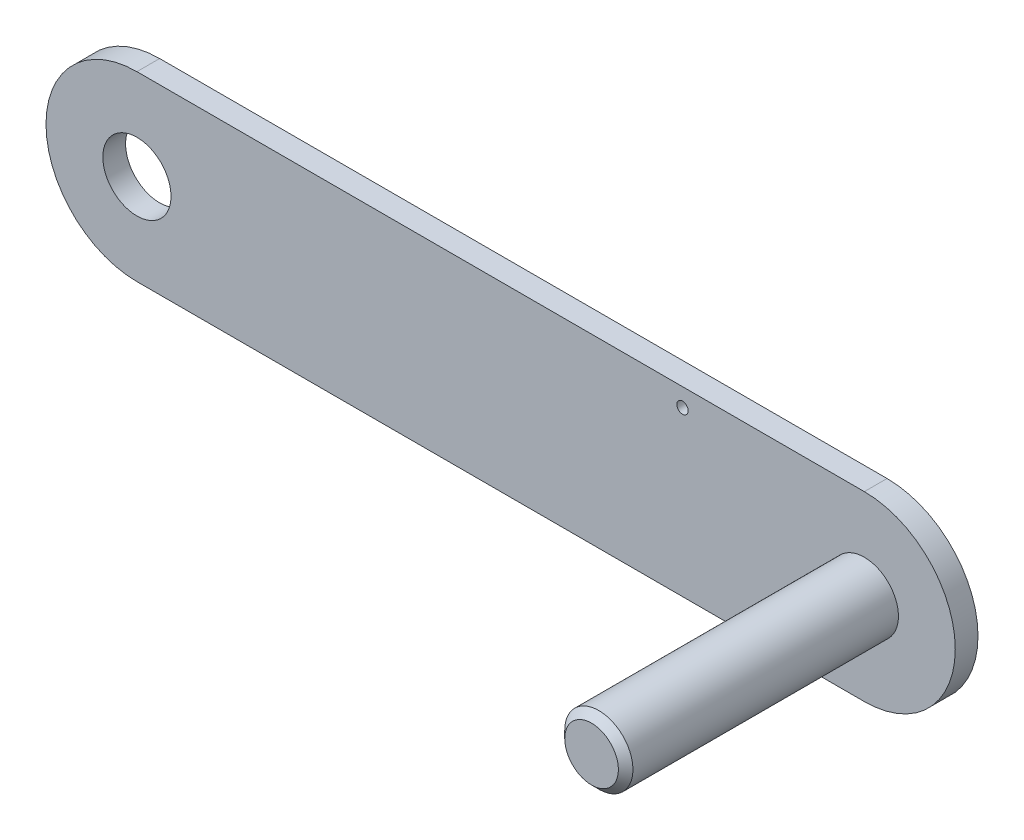
ISO-10303-21;
HEADER;
FILE_DESCRIPTION(('STEP AP214'),'2;1');
FILE_NAME('part.step','',(''),(''),'','','');
FILE_SCHEMA(('AUTOMOTIVE_DESIGN { 1 0 10303 214 1 1 1 1 }'));
ENDSEC;
DATA;
#1=APPLICATION_CONTEXT('core data for automotive mechanical design processes');
#2=APPLICATION_PROTOCOL_DEFINITION('international standard','automotive_design',2000,#1);
#3=PRODUCT_CONTEXT('',#1,'mechanical');
#4=PRODUCT('Part','Part','',(#3));
#5=PRODUCT_RELATED_PRODUCT_CATEGORY('part','',(#4));
#6=PRODUCT_DEFINITION_FORMATION('','',#4);
#7=PRODUCT_DEFINITION_CONTEXT('part definition',#1,'design');
#8=PRODUCT_DEFINITION('design','',#6,#7);
#9=PRODUCT_DEFINITION_SHAPE('','',#8);
#10=(LENGTH_UNIT() NAMED_UNIT(*) SI_UNIT(.MILLI.,.METRE.));
#11=(NAMED_UNIT(*) PLANE_ANGLE_UNIT() SI_UNIT($,.RADIAN.));
#12=(NAMED_UNIT(*) SI_UNIT($,.STERADIAN.) SOLID_ANGLE_UNIT());
#13=UNCERTAINTY_MEASURE_WITH_UNIT(LENGTH_MEASURE(1.E-05),#10,'distance_accuracy_value','');
#14=(GEOMETRIC_REPRESENTATION_CONTEXT(3) GLOBAL_UNCERTAINTY_ASSIGNED_CONTEXT((#13)) GLOBAL_UNIT_ASSIGNED_CONTEXT((#10,
#11,#12)) REPRESENTATION_CONTEXT('',''));
#15=CARTESIAN_POINT('',(0.,0.,0.));
#16=DIRECTION('',(0.,0.,1.));
#17=DIRECTION('',(1.,0.,0.));
#18=AXIS2_PLACEMENT_3D('',#15,#16,#17);
#19=CARTESIAN_POINT('',(0.,0.,19.05));
#20=DIRECTION('',(0.,0.,-1.));
#21=DIRECTION('',(-1.,0.,0.));
#22=AXIS2_PLACEMENT_3D('',#19,#20,#21);
#23=CYLINDRICAL_SURFACE('',#22,2.38125);
#24=CARTESIAN_POINT('',(0.,0.,18.542));
#25=DIRECTION('',(0.,0.,1.));
#26=DIRECTION('',(1.,0.,0.));
#27=AXIS2_PLACEMENT_3D('',#24,#25,#26);
#28=CIRCLE('',#27,2.38125);
#29=CARTESIAN_POINT('',(-2.38125,0.,18.542));
#30=VERTEX_POINT('',#29);
#31=EDGE_CURVE('E11',#30,#30,#28,.F.);
#32=CARTESIAN_POINT('',(0.,0.,0.));
#33=DIRECTION('',(0.,0.,-1.));
#34=DIRECTION('',(-1.,0.,0.));
#35=AXIS2_PLACEMENT_3D('',#32,#33,#34);
#36=CIRCLE('',#35,2.38125);
#37=CARTESIAN_POINT('',(-2.38125,0.,0.));
#38=VERTEX_POINT('',#37);
#39=EDGE_CURVE('E114',#38,#38,#36,.T.);
#40=CARTESIAN_POINT('',(-2.38125,0.,18.542));
#41=CARTESIAN_POINT('',(-2.38125,0.,18.3488541666667));
#42=CARTESIAN_POINT('',(-2.38125,0.,18.1557083333333));
#43=CARTESIAN_POINT('',(-2.38125,0.,17.7694166666667));
#44=CARTESIAN_POINT('',(-2.38125,0.,17.5762708333333));
#45=CARTESIAN_POINT('',(-2.38125,0.,17.1899791666667));
#46=CARTESIAN_POINT('',(-2.38125,0.,16.9968333333333));
#47=CARTESIAN_POINT('',(-2.38125,0.,16.6105416666667));
#48=CARTESIAN_POINT('',(-2.38125,0.,16.4173958333333));
#49=CARTESIAN_POINT('',(-2.38125,0.,16.0311041666667));
#50=CARTESIAN_POINT('',(-2.38125,0.,15.8379583333333));
#51=CARTESIAN_POINT('',(-2.38125,0.,15.4516666666667));
#52=CARTESIAN_POINT('',(-2.38125,0.,15.2585208333333));
#53=CARTESIAN_POINT('',(-2.38125,0.,14.8722291666667));
#54=CARTESIAN_POINT('',(-2.38125,0.,14.6790833333333));
#55=CARTESIAN_POINT('',(-2.38125,0.,14.2927916666667));
#56=CARTESIAN_POINT('',(-2.38125,0.,14.0996458333333));
#57=CARTESIAN_POINT('',(-2.38125,0.,13.7133541666667));
#58=CARTESIAN_POINT('',(-2.38125,0.,13.5202083333333));
#59=CARTESIAN_POINT('',(-2.38125,0.,13.1339166666667));
#60=CARTESIAN_POINT('',(-2.38125,0.,12.9407708333333));
#61=CARTESIAN_POINT('',(-2.38125,0.,12.5544791666667));
#62=CARTESIAN_POINT('',(-2.38125,0.,12.3613333333333));
#63=CARTESIAN_POINT('',(-2.38125,0.,11.9750416666667));
#64=CARTESIAN_POINT('',(-2.38125,0.,11.7818958333333));
#65=CARTESIAN_POINT('',(-2.38125,0.,11.3956041666667));
#66=CARTESIAN_POINT('',(-2.38125,0.,11.2024583333333));
#67=CARTESIAN_POINT('',(-2.38125,0.,10.8161666666667));
#68=CARTESIAN_POINT('',(-2.38125,0.,10.6230208333333));
#69=CARTESIAN_POINT('',(-2.38125,0.,10.2367291666667));
#70=CARTESIAN_POINT('',(-2.38125,0.,10.0435833333333));
#71=CARTESIAN_POINT('',(-2.38125,0.,9.65729166666667));
#72=CARTESIAN_POINT('',(-2.38125,0.,9.46414583333334));
#73=CARTESIAN_POINT('',(-2.38125,0.,9.07785416666667));
#74=CARTESIAN_POINT('',(-2.38125,0.,8.88470833333334));
#75=CARTESIAN_POINT('',(-2.38125,0.,8.49841666666667));
#76=CARTESIAN_POINT('',(-2.38125,0.,8.30527083333334));
#77=CARTESIAN_POINT('',(-2.38125,0.,7.91897916666667));
#78=CARTESIAN_POINT('',(-2.38125,0.,7.72583333333334));
#79=CARTESIAN_POINT('',(-2.38125,0.,7.33954166666667));
#80=CARTESIAN_POINT('',(-2.38125,0.,7.14639583333334));
#81=CARTESIAN_POINT('',(-2.38125,0.,6.76010416666667));
#82=CARTESIAN_POINT('',(-2.38125,0.,6.56695833333334));
#83=CARTESIAN_POINT('',(-2.38125,0.,6.18066666666667));
#84=CARTESIAN_POINT('',(-2.38125,0.,5.98752083333333));
#85=CARTESIAN_POINT('',(-2.38125,0.,5.60122916666667));
#86=CARTESIAN_POINT('',(-2.38125,0.,5.40808333333333));
#87=CARTESIAN_POINT('',(-2.38125,0.,5.02179166666667));
#88=CARTESIAN_POINT('',(-2.38125,0.,4.82864583333333));
#89=CARTESIAN_POINT('',(-2.38125,0.,4.44235416666667));
#90=CARTESIAN_POINT('',(-2.38125,0.,4.24920833333333));
#91=CARTESIAN_POINT('',(-2.38125,0.,3.86291666666667));
#92=CARTESIAN_POINT('',(-2.38125,0.,3.66977083333333));
#93=CARTESIAN_POINT('',(-2.38125,0.,3.28347916666667));
#94=CARTESIAN_POINT('',(-2.38125,0.,3.09033333333333));
#95=CARTESIAN_POINT('',(-2.38125,0.,2.70404166666667));
#96=CARTESIAN_POINT('',(-2.38125,0.,2.51089583333333));
#97=CARTESIAN_POINT('',(-2.38125,0.,2.12460416666667));
#98=CARTESIAN_POINT('',(-2.38125,0.,1.93145833333333));
#99=CARTESIAN_POINT('',(-2.38125,0.,1.54516666666666));
#100=CARTESIAN_POINT('',(-2.38125,0.,1.35202083333333));
#101=CARTESIAN_POINT('',(-2.38125,0.,0.965729166666665));
#102=CARTESIAN_POINT('',(-2.38125,0.,0.772583333333334));
#103=CARTESIAN_POINT('',(-2.38125,0.,0.386291666666668));
#104=CARTESIAN_POINT('',(-2.38125,0.,0.193145833333334));
#105=CARTESIAN_POINT('',(-2.38125,0.,0.));
#106=B_SPLINE_CURVE_WITH_KNOTS('',3,(#40,#41,#42,#43,#44,#45,#46,#47,#48,#49,#50,#51,#52,#53,
#54,#55,#56,#57,#58,#59,#60,#61,#62,#63,#64,#65,#66,#67,#68,#69,#70,#71,#72,#73,#74,#75,#76,#77,
#78,#79,#80,#81,#82,#83,#84,#85,#86,#87,#88,#89,#90,#91,#92,#93,#94,#95,#96,#97,#98,#99,#100,
#101,#102,#103,#104,#105),.UNSPECIFIED.,.F.,.F.,(4,2,2,2,2,2,2,2,2,2,2,2,2,2,2,2,2,2,2,2,2,2,2,
2,2,2,2,2,2,2,2,2,4),(0.,0.579437500000002,1.158875,1.7383125,2.31775,2.89718750000001,3.476625,
4.05606250000001,4.6355,5.21493750000001,5.79437500000001,6.37381250000001,6.95325000000001,
7.53268750000001,8.11212500000001,8.69156250000001,9.27100000000001,9.85043750000001,10.429875,
11.0093125,11.58875,12.1681875,12.747625,13.3270625,13.9065,14.4859375,15.065375,15.6448125,
16.22425,16.8036875,17.383125,17.9625625,18.542),.UNSPECIFIED.);
#107=EDGE_CURVE('BSEAM35',#30,#38,#106,.T.);
#108=ORIENTED_EDGE('',*,*,#31,.T.);
#109=ORIENTED_EDGE('',*,*,#39,.F.);
#110=ORIENTED_EDGE('',*,*,#107,.T.);
#111=ORIENTED_EDGE('',*,*,#107,.F.);
#112=EDGE_LOOP('',(#108,#110,#109,#111));
#113=FACE_BOUND('',#112,.T.);
#114=ADVANCED_FACE('F35',(#113),#23,.T.);
#115=CARTESIAN_POINT('',(0.,0.,19.05));
#116=DIRECTION('',(0.,0.,1.));
#117=DIRECTION('',(1.,0.,0.));
#118=AXIS2_PLACEMENT_3D('',#115,#116,#117);
#119=PLANE('',#118);
#120=CARTESIAN_POINT('',(0.,0.,19.05));
#121=DIRECTION('',(0.,0.,1.));
#122=DIRECTION('',(1.,0.,0.));
#123=AXIS2_PLACEMENT_3D('',#120,#121,#122);
#124=CIRCLE('',#123,1.87325000000001);
#125=CARTESIAN_POINT('',(1.87325000000001,0.,19.05));
#126=VERTEX_POINT('',#125);
#127=EDGE_CURVE('E44',#126,#126,#124,.T.);
#128=ORIENTED_EDGE('',*,*,#127,.T.);
#129=EDGE_LOOP('',(#128));
#130=FACE_BOUND('',#129,.T.);
#131=ADVANCED_FACE('F119',(#130),#119,.T.);
#132=CARTESIAN_POINT('',(0.,0.,19.05));
#133=DIRECTION('',(0.,0.,-1.));
#134=DIRECTION('',(-1.,0.,0.));
#135=AXIS2_PLACEMENT_3D('',#132,#133,#134);
#136=CONICAL_SURFACE('',#135,1.87325000000001,0.785398163397447);
#137=ORIENTED_EDGE('',*,*,#31,.F.);
#138=EDGE_LOOP('',(#137));
#139=FACE_BOUND('',#138,.T.);
#140=ORIENTED_EDGE('',*,*,#127,.F.);
#141=EDGE_LOOP('',(#140));
#142=FACE_BOUND('',#141,.T.);
#143=ADVANCED_FACE('F37',(#139,#142),#136,.T.);
#144=CARTESIAN_POINT('',(0.,0.,0.));
#145=DIRECTION('',(0.,0.,-1.));
#146=DIRECTION('',(-1.,0.,0.));
#147=AXIS2_PLACEMENT_3D('',#144,#145,#146);
#148=PLANE('',#147);
#149=CARTESIAN_POINT('',(-12.7,5.08,0.));
#150=DIRECTION('',(0.,0.,1.));
#151=DIRECTION('',(1.,0.,0.));
#152=AXIS2_PLACEMENT_3D('',#149,#150,#151);
#153=CIRCLE('',#152,0.396875);
#154=CARTESIAN_POINT('',(-12.303125,5.08,0.));
#155=VERTEX_POINT('',#154);
#156=EDGE_CURVE('E167',#155,#155,#153,.T.);
#157=ORIENTED_EDGE('',*,*,#156,.F.);
#158=EDGE_LOOP('',(#157));
#159=FACE_BOUND('',#158,.T.);
#160=CARTESIAN_POINT('',(-50.8,0.,0.));
#161=DIRECTION('',(0.,0.,-1.));
#162=DIRECTION('',(-1.,0.,0.));
#163=AXIS2_PLACEMENT_3D('',#160,#161,#162);
#164=CIRCLE('',#163,2.38125);
#165=CARTESIAN_POINT('',(-53.18125,0.,0.));
#166=VERTEX_POINT('',#165);
#167=EDGE_CURVE('E169',#166,#166,#164,.T.);
#168=ORIENTED_EDGE('',*,*,#167,.T.);
#169=EDGE_LOOP('',(#168));
#170=FACE_BOUND('',#169,.T.);
#171=CARTESIAN_POINT('',(0.,0.,0.));
#172=DIRECTION('',(0.,0.,-1.));
#173=DIRECTION('',(-1.,0.,0.));
#174=AXIS2_PLACEMENT_3D('',#171,#172,#173);
#175=CIRCLE('',#174,6.35);
#176=CARTESIAN_POINT('',(0.,6.35,0.));
#177=VERTEX_POINT('',#176);
#178=CARTESIAN_POINT('',(0.,-6.35,0.));
#179=VERTEX_POINT('',#178);
#180=EDGE_CURVE('E104',#177,#179,#175,.T.);
#181=ORIENTED_EDGE('',*,*,#180,.F.);
#182=DIRECTION('',(1.,0.,0.));
#183=VECTOR('',#182,1.);
#184=CARTESIAN_POINT('',(0.,6.35,0.));
#185=LINE('',#184,#183);
#186=CARTESIAN_POINT('',(-50.8,6.35,0.));
#187=VERTEX_POINT('',#186);
#188=EDGE_CURVE('E75',#187,#177,#185,.T.);
#189=ORIENTED_EDGE('',*,*,#188,.F.);
#190=CARTESIAN_POINT('',(-50.8,0.,0.));
#191=DIRECTION('',(0.,0.,-1.));
#192=DIRECTION('',(1.,0.,0.));
#193=AXIS2_PLACEMENT_3D('',#190,#191,#192);
#194=CIRCLE('',#193,6.35);
#195=CARTESIAN_POINT('',(-50.8,-6.35,0.));
#196=VERTEX_POINT('',#195);
#197=EDGE_CURVE('E69',#196,#187,#194,.T.);
#198=ORIENTED_EDGE('',*,*,#197,.F.);
#199=DIRECTION('',(-1.,0.,0.));
#200=VECTOR('',#199,1.);
#201=CARTESIAN_POINT('',(0.,-6.35,0.));
#202=LINE('',#201,#200);
#203=EDGE_CURVE('E94',#179,#196,#202,.T.);
#204=ORIENTED_EDGE('',*,*,#203,.F.);
#205=EDGE_LOOP('',(#181,#189,#198,#204));
#206=FACE_BOUND('',#205,.T.);
#207=ORIENTED_EDGE('',*,*,#39,.T.);
#208=EDGE_LOOP('',(#207));
#209=FACE_BOUND('',#208,.T.);
#210=ADVANCED_FACE('F122',(#159,#170,#206,#209),#148,.F.);
#211=CARTESIAN_POINT('',(0.,0.,-1.5875));
#212=DIRECTION('',(0.,0.,-1.));
#213=DIRECTION('',(-1.,0.,0.));
#214=AXIS2_PLACEMENT_3D('',#211,#212,#213);
#215=PLANE('',#214);
#216=CARTESIAN_POINT('',(-12.7,5.08,-1.5875));
#217=DIRECTION('',(0.,0.,1.));
#218=DIRECTION('',(1.,0.,0.));
#219=AXIS2_PLACEMENT_3D('',#216,#217,#218);
#220=CIRCLE('',#219,0.396875);
#221=CARTESIAN_POINT('',(-12.303125,5.08,-1.5875));
#222=VERTEX_POINT('',#221);
#223=EDGE_CURVE('E164',#222,#222,#220,.T.);
#224=ORIENTED_EDGE('',*,*,#223,.T.);
#225=EDGE_LOOP('',(#224));
#226=FACE_BOUND('',#225,.T.);
#227=CARTESIAN_POINT('',(0.,0.,-1.5875));
#228=DIRECTION('',(0.,0.,-1.));
#229=DIRECTION('',(-1.,0.,0.));
#230=AXIS2_PLACEMENT_3D('',#227,#228,#229);
#231=CIRCLE('',#230,6.35);
#232=CARTESIAN_POINT('',(0.,6.35,-1.5875));
#233=VERTEX_POINT('',#232);
#234=CARTESIAN_POINT('',(0.,-6.35,-1.5875));
#235=VERTEX_POINT('',#234);
#236=EDGE_CURVE('E89',#233,#235,#231,.T.);
#237=ORIENTED_EDGE('',*,*,#236,.T.);
#238=DIRECTION('',(-1.,0.,0.));
#239=VECTOR('',#238,1.);
#240=CARTESIAN_POINT('',(0.,-6.35,-1.5875));
#241=LINE('',#240,#239);
#242=CARTESIAN_POINT('',(-50.8,-6.35,-1.5875));
#243=VERTEX_POINT('',#242);
#244=EDGE_CURVE('E83',#235,#243,#241,.T.);
#245=ORIENTED_EDGE('',*,*,#244,.T.);
#246=CARTESIAN_POINT('',(-50.8,0.,-1.5875));
#247=DIRECTION('',(0.,0.,-1.));
#248=DIRECTION('',(1.,0.,0.));
#249=AXIS2_PLACEMENT_3D('',#246,#247,#248);
#250=CIRCLE('',#249,6.35);
#251=CARTESIAN_POINT('',(-50.8,6.35,-1.5875));
#252=VERTEX_POINT('',#251);
#253=EDGE_CURVE('E87',#243,#252,#250,.T.);
#254=ORIENTED_EDGE('',*,*,#253,.T.);
#255=DIRECTION('',(1.,0.,0.));
#256=VECTOR('',#255,1.);
#257=CARTESIAN_POINT('',(0.,6.35,-1.5875));
#258=LINE('',#257,#256);
#259=EDGE_CURVE('E52',#252,#233,#258,.T.);
#260=ORIENTED_EDGE('',*,*,#259,.T.);
#261=EDGE_LOOP('',(#237,#245,#254,#260));
#262=FACE_BOUND('',#261,.T.);
#263=CARTESIAN_POINT('',(-50.8,0.,-1.5875));
#264=DIRECTION('',(0.,0.,-1.));
#265=DIRECTION('',(-1.,0.,0.));
#266=AXIS2_PLACEMENT_3D('',#263,#264,#265);
#267=CIRCLE('',#266,2.38125);
#268=CARTESIAN_POINT('',(-53.18125,0.,-1.5875));
#269=VERTEX_POINT('',#268);
#270=EDGE_CURVE('E107',#269,#269,#267,.T.);
#271=ORIENTED_EDGE('',*,*,#270,.F.);
#272=EDGE_LOOP('',(#271));
#273=FACE_BOUND('',#272,.T.);
#274=ADVANCED_FACE('F84',(#226,#262,#273),#215,.T.);
#275=CARTESIAN_POINT('',(0.,0.,-1.5875));
#276=DIRECTION('',(0.,0.,1.));
#277=DIRECTION('',(1.,0.,0.));
#278=AXIS2_PLACEMENT_3D('',#275,#276,#277);
#279=CYLINDRICAL_SURFACE('',#278,6.35);
#280=ORIENTED_EDGE('',*,*,#180,.T.);
#281=DIRECTION('',(0.,0.,1.));
#282=VECTOR('',#281,1.);
#283=CARTESIAN_POINT('',(0.,-6.35,-1.5875));
#284=LINE('',#283,#282);
#285=EDGE_CURVE('E95',#235,#179,#284,.T.);
#286=ORIENTED_EDGE('',*,*,#285,.F.);
#287=ORIENTED_EDGE('',*,*,#236,.F.);
#288=DIRECTION('',(0.,0.,1.));
#289=VECTOR('',#288,1.);
#290=CARTESIAN_POINT('',(0.,6.35,-1.5875));
#291=LINE('',#290,#289);
#292=EDGE_CURVE('E100',#233,#177,#291,.T.);
#293=ORIENTED_EDGE('',*,*,#292,.T.);
#294=EDGE_LOOP('',(#280,#286,#287,#293));
#295=FACE_BOUND('',#294,.T.);
#296=ADVANCED_FACE('F138',(#295),#279,.T.);
#297=CARTESIAN_POINT('',(0.,-6.35,-1.5875));
#298=DIRECTION('',(0.,1.,0.));
#299=DIRECTION('',(0.,0.,1.));
#300=AXIS2_PLACEMENT_3D('',#297,#298,#299);
#301=PLANE('',#300);
#302=ORIENTED_EDGE('',*,*,#203,.T.);
#303=DIRECTION('',(0.,0.,1.));
#304=VECTOR('',#303,1.);
#305=CARTESIAN_POINT('',(-50.8,-6.35,-1.5875));
#306=LINE('',#305,#304);
#307=EDGE_CURVE('E92',#243,#196,#306,.T.);
#308=ORIENTED_EDGE('',*,*,#307,.F.);
#309=ORIENTED_EDGE('',*,*,#244,.F.);
#310=ORIENTED_EDGE('',*,*,#285,.T.);
#311=EDGE_LOOP('',(#302,#308,#309,#310));
#312=FACE_BOUND('',#311,.T.);
#313=ADVANCED_FACE('F93',(#312),#301,.F.);
#314=CARTESIAN_POINT('',(-50.8,0.,-1.5875));
#315=DIRECTION('',(0.,0.,1.));
#316=DIRECTION('',(1.,0.,0.));
#317=AXIS2_PLACEMENT_3D('',#314,#315,#316);
#318=CYLINDRICAL_SURFACE('',#317,6.35);
#319=ORIENTED_EDGE('',*,*,#197,.T.);
#320=DIRECTION('',(0.,0.,1.));
#321=VECTOR('',#320,1.);
#322=CARTESIAN_POINT('',(-50.8,6.35,-1.5875));
#323=LINE('',#322,#321);
#324=EDGE_CURVE('E96',#252,#187,#323,.T.);
#325=ORIENTED_EDGE('',*,*,#324,.F.);
#326=ORIENTED_EDGE('',*,*,#253,.F.);
#327=ORIENTED_EDGE('',*,*,#307,.T.);
#328=EDGE_LOOP('',(#319,#325,#326,#327));
#329=FACE_BOUND('',#328,.T.);
#330=ADVANCED_FACE('F98',(#329),#318,.T.);
#331=CARTESIAN_POINT('',(0.,6.35,-1.5875));
#332=DIRECTION('',(0.,-1.,0.));
#333=DIRECTION('',(0.,0.,-1.));
#334=AXIS2_PLACEMENT_3D('',#331,#332,#333);
#335=PLANE('',#334);
#336=ORIENTED_EDGE('',*,*,#188,.T.);
#337=ORIENTED_EDGE('',*,*,#292,.F.);
#338=ORIENTED_EDGE('',*,*,#259,.F.);
#339=ORIENTED_EDGE('',*,*,#324,.T.);
#340=EDGE_LOOP('',(#336,#337,#338,#339));
#341=FACE_BOUND('',#340,.T.);
#342=ADVANCED_FACE('F146',(#341),#335,.F.);
#343=CARTESIAN_POINT('',(-50.8,0.,-1.5875));
#344=DIRECTION('',(0.,0.,1.));
#345=DIRECTION('',(1.,0.,0.));
#346=AXIS2_PLACEMENT_3D('',#343,#344,#345);
#347=CYLINDRICAL_SURFACE('',#346,2.38125);
#348=ORIENTED_EDGE('',*,*,#270,.T.);
#349=EDGE_LOOP('',(#348));
#350=FACE_BOUND('',#349,.T.);
#351=ORIENTED_EDGE('',*,*,#167,.F.);
#352=EDGE_LOOP('',(#351));
#353=FACE_BOUND('',#352,.T.);
#354=ADVANCED_FACE('F148',(#350,#353),#347,.F.);
#355=CARTESIAN_POINT('',(-12.7,5.08,-1.5875));
#356=DIRECTION('',(0.,0.,1.));
#357=DIRECTION('',(1.,0.,0.));
#358=AXIS2_PLACEMENT_3D('',#355,#356,#357);
#359=CYLINDRICAL_SURFACE('',#358,0.396875);
#360=ORIENTED_EDGE('',*,*,#223,.F.);
#361=EDGE_LOOP('',(#360));
#362=FACE_BOUND('',#361,.T.);
#363=ORIENTED_EDGE('',*,*,#156,.T.);
#364=EDGE_LOOP('',(#363));
#365=FACE_BOUND('',#364,.T.);
#366=ADVANCED_FACE('F155',(#362,#365),#359,.F.);
#367=CLOSED_SHELL('',(#114,#131,#143,#210,#274,#296,#313,#330,#342,#354,#366));
#368=MANIFOLD_SOLID_BREP('B2',#367);
#369=ADVANCED_BREP_SHAPE_REPRESENTATION('',(#18,#368),#14);
#370=SHAPE_DEFINITION_REPRESENTATION(#9,#369);
ENDSEC;
END-ISO-10303-21;
